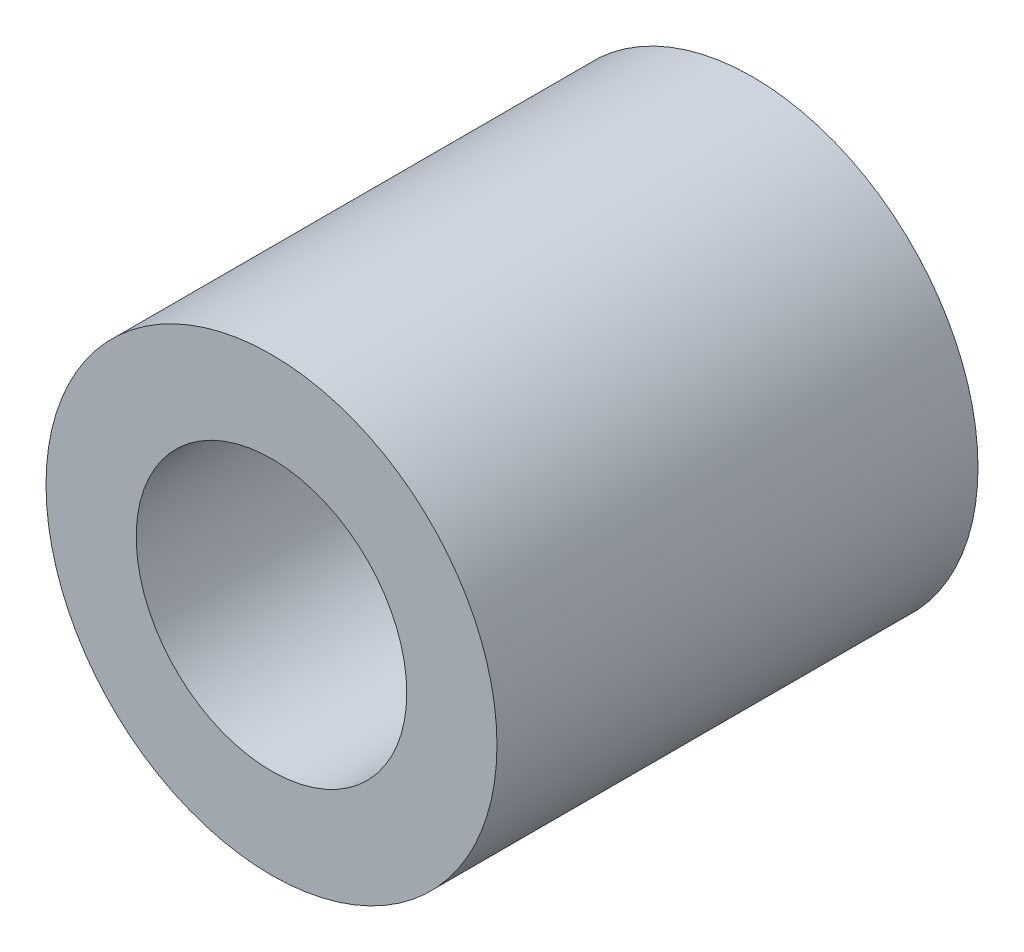
ISO-10303-21;
HEADER;
FILE_DESCRIPTION(('STEP AP214'),'2;1');
FILE_NAME('part.step','',(''),(''),'','','');
FILE_SCHEMA(('AUTOMOTIVE_DESIGN { 1 0 10303 214 1 1 1 1 }'));
ENDSEC;
DATA;
#1=APPLICATION_CONTEXT('core data for automotive mechanical design processes');
#2=APPLICATION_PROTOCOL_DEFINITION('international standard','automotive_design',2000,#1);
#3=PRODUCT_CONTEXT('',#1,'mechanical');
#4=PRODUCT('Part','Part','',(#3));
#5=PRODUCT_RELATED_PRODUCT_CATEGORY('part','',(#4));
#6=PRODUCT_DEFINITION_FORMATION('','',#4);
#7=PRODUCT_DEFINITION_CONTEXT('part definition',#1,'design');
#8=PRODUCT_DEFINITION('design','',#6,#7);
#9=PRODUCT_DEFINITION_SHAPE('','',#8);
#10=(LENGTH_UNIT() NAMED_UNIT(*) SI_UNIT(.MILLI.,.METRE.));
#11=(NAMED_UNIT(*) PLANE_ANGLE_UNIT() SI_UNIT($,.RADIAN.));
#12=(NAMED_UNIT(*) SI_UNIT($,.STERADIAN.) SOLID_ANGLE_UNIT());
#13=UNCERTAINTY_MEASURE_WITH_UNIT(LENGTH_MEASURE(1.E-05),#10,'distance_accuracy_value','');
#14=(GEOMETRIC_REPRESENTATION_CONTEXT(3) GLOBAL_UNCERTAINTY_ASSIGNED_CONTEXT((#13)) GLOBAL_UNIT_ASSIGNED_CONTEXT((#10,
#11,#12)) REPRESENTATION_CONTEXT('',''));
#15=CARTESIAN_POINT('',(0.,0.,0.));
#16=DIRECTION('',(0.,0.,1.));
#17=DIRECTION('',(1.,0.,0.));
#18=AXIS2_PLACEMENT_3D('',#15,#16,#17);
#19=CARTESIAN_POINT('',(0.,0.,8.));
#20=DIRECTION('',(0.,0.,1.));
#21=DIRECTION('',(1.,0.,0.));
#22=AXIS2_PLACEMENT_3D('',#19,#20,#21);
#23=PLANE('',#22);
#24=CARTESIAN_POINT('',(0.,0.,8.));
#25=DIRECTION('',(0.,0.,1.));
#26=DIRECTION('',(1.,0.,0.));
#27=AXIS2_PLACEMENT_3D('',#24,#25,#26);
#28=CIRCLE('',#27,7.5);
#29=CARTESIAN_POINT('',(7.5,0.,8.));
#30=VERTEX_POINT('',#29);
#31=EDGE_CURVE('E10',#30,#30,#28,.T.);
#32=ORIENTED_EDGE('',*,*,#31,.T.);
#33=EDGE_LOOP('',(#32));
#34=FACE_BOUND('',#33,.T.);
#35=CARTESIAN_POINT('',(0.,0.,8.));
#36=DIRECTION('',(0.,0.,1.));
#37=DIRECTION('',(1.,0.,0.));
#38=AXIS2_PLACEMENT_3D('',#35,#36,#37);
#39=CIRCLE('',#38,4.5);
#40=CARTESIAN_POINT('',(4.5,0.,8.));
#41=VERTEX_POINT('',#40);
#42=EDGE_CURVE('E45',#41,#41,#39,.T.);
#43=ORIENTED_EDGE('',*,*,#42,.F.);
#44=EDGE_LOOP('',(#43));
#45=FACE_BOUND('',#44,.T.);
#46=ADVANCED_FACE('F34',(#34,#45),#23,.T.);
#47=CARTESIAN_POINT('',(0.,0.,-8.));
#48=DIRECTION('',(0.,0.,1.));
#49=DIRECTION('',(1.,0.,0.));
#50=AXIS2_PLACEMENT_3D('',#47,#48,#49);
#51=PLANE('',#50);
#52=CARTESIAN_POINT('',(0.,0.,-8.));
#53=DIRECTION('',(0.,0.,1.));
#54=DIRECTION('',(1.,0.,0.));
#55=AXIS2_PLACEMENT_3D('',#52,#53,#54);
#56=CIRCLE('',#55,7.5);
#57=CARTESIAN_POINT('',(7.5,0.,-8.));
#58=VERTEX_POINT('',#57);
#59=EDGE_CURVE('E38',#58,#58,#56,.T.);
#60=ORIENTED_EDGE('',*,*,#59,.F.);
#61=EDGE_LOOP('',(#60));
#62=FACE_BOUND('',#61,.T.);
#63=CARTESIAN_POINT('',(0.,0.,-8.));
#64=DIRECTION('',(0.,0.,1.));
#65=DIRECTION('',(1.,0.,0.));
#66=AXIS2_PLACEMENT_3D('',#63,#64,#65);
#67=CIRCLE('',#66,4.5);
#68=CARTESIAN_POINT('',(4.5,0.,-8.));
#69=VERTEX_POINT('',#68);
#70=EDGE_CURVE('E47',#69,#69,#67,.T.);
#71=ORIENTED_EDGE('',*,*,#70,.T.);
#72=EDGE_LOOP('',(#71));
#73=FACE_BOUND('',#72,.T.);
#74=ADVANCED_FACE('F57',(#62,#73),#51,.F.);
#75=CARTESIAN_POINT('',(0.,0.,8.));
#76=DIRECTION('',(0.,0.,-1.));
#77=DIRECTION('',(-1.,0.,0.));
#78=AXIS2_PLACEMENT_3D('',#75,#76,#77);
#79=CYLINDRICAL_SURFACE('',#78,7.5);
#80=ORIENTED_EDGE('',*,*,#31,.F.);
#81=EDGE_LOOP('',(#80));
#82=FACE_BOUND('',#81,.T.);
#83=ORIENTED_EDGE('',*,*,#59,.T.);
#84=EDGE_LOOP('',(#83));
#85=FACE_BOUND('',#84,.T.);
#86=ADVANCED_FACE('F36',(#82,#85),#79,.T.);
#87=CARTESIAN_POINT('',(0.,0.,8.));
#88=DIRECTION('',(0.,0.,-1.));
#89=DIRECTION('',(-1.,0.,0.));
#90=AXIS2_PLACEMENT_3D('',#87,#88,#89);
#91=CYLINDRICAL_SURFACE('',#90,4.5);
#92=ORIENTED_EDGE('',*,*,#42,.T.);
#93=EDGE_LOOP('',(#92));
#94=FACE_BOUND('',#93,.T.);
#95=ORIENTED_EDGE('',*,*,#70,.F.);
#96=EDGE_LOOP('',(#95));
#97=FACE_BOUND('',#96,.T.);
#98=ADVANCED_FACE('F53',(#94,#97),#91,.F.);
#99=CLOSED_SHELL('',(#46,#74,#86,#98));
#100=MANIFOLD_SOLID_BREP('B2',#99);
#101=ADVANCED_BREP_SHAPE_REPRESENTATION('',(#18,#100),#14);
#102=SHAPE_DEFINITION_REPRESENTATION(#9,#101);
ENDSEC;
END-ISO-10303-21;
